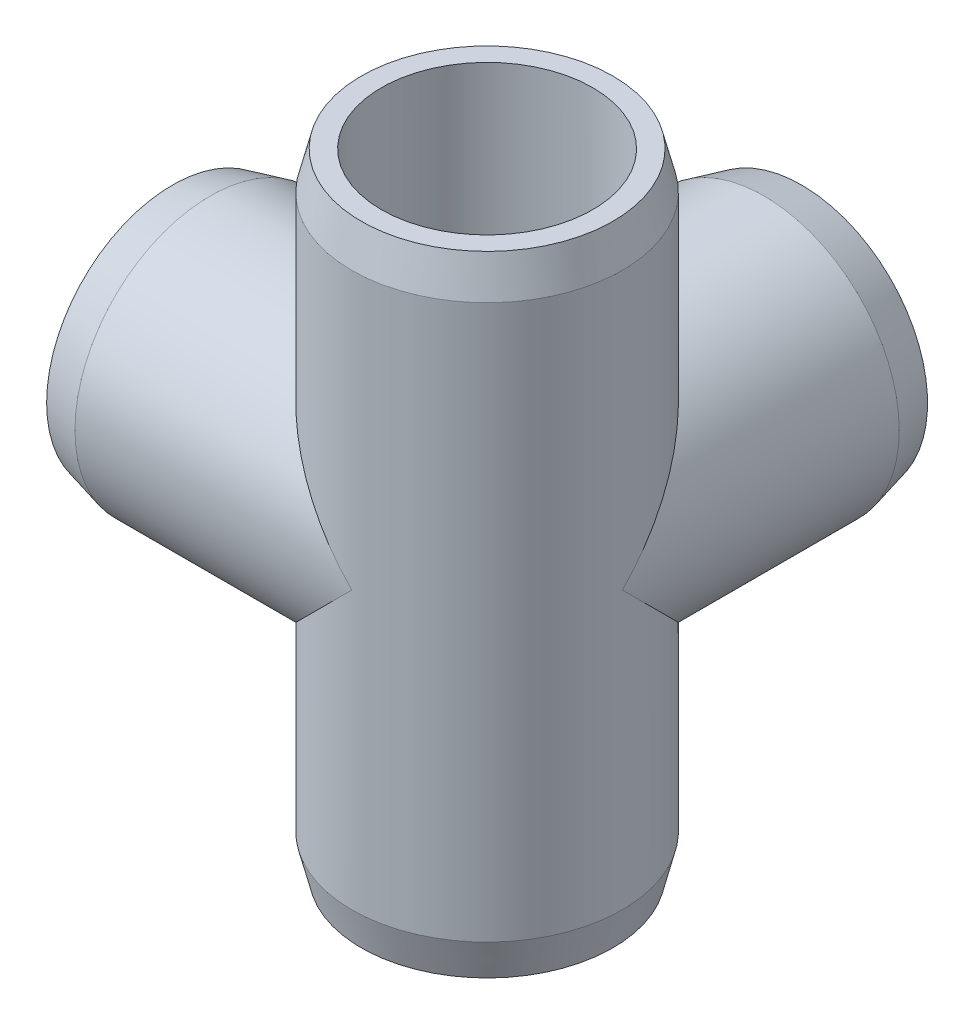
ISO-10303-21;
HEADER;
FILE_DESCRIPTION(('STEP AP214'),'2;1');
FILE_NAME('part.step','',(''),(''),'','','');
FILE_SCHEMA(('AUTOMOTIVE_DESIGN { 1 0 10303 214 1 1 1 1 }'));
ENDSEC;
DATA;
#1=APPLICATION_CONTEXT('core data for automotive mechanical design processes');
#2=APPLICATION_PROTOCOL_DEFINITION('international standard','automotive_design',2000,#1);
#3=PRODUCT_CONTEXT('',#1,'mechanical');
#4=PRODUCT('Part','Part','',(#3));
#5=PRODUCT_RELATED_PRODUCT_CATEGORY('part','',(#4));
#6=PRODUCT_DEFINITION_FORMATION('','',#4);
#7=PRODUCT_DEFINITION_CONTEXT('part definition',#1,'design');
#8=PRODUCT_DEFINITION('design','',#6,#7);
#9=PRODUCT_DEFINITION_SHAPE('','',#8);
#10=(LENGTH_UNIT() NAMED_UNIT(*) SI_UNIT(.MILLI.,.METRE.));
#11=(NAMED_UNIT(*) PLANE_ANGLE_UNIT() SI_UNIT($,.RADIAN.));
#12=(NAMED_UNIT(*) SI_UNIT($,.STERADIAN.) SOLID_ANGLE_UNIT());
#13=UNCERTAINTY_MEASURE_WITH_UNIT(LENGTH_MEASURE(1.E-05),#10,'distance_accuracy_value','');
#14=(GEOMETRIC_REPRESENTATION_CONTEXT(3) GLOBAL_UNCERTAINTY_ASSIGNED_CONTEXT((#13)) GLOBAL_UNIT_ASSIGNED_CONTEXT((#10,
#11,#12)) REPRESENTATION_CONTEXT('',''));
#15=CARTESIAN_POINT('',(0.,0.,0.));
#16=DIRECTION('',(0.,0.,1.));
#17=DIRECTION('',(1.,0.,0.));
#18=AXIS2_PLACEMENT_3D('',#15,#16,#17);
#19=CARTESIAN_POINT('',(-31.75,31.75,0.));
#20=DIRECTION('',(-1.,0.,0.));
#21=DIRECTION('',(0.,0.,1.));
#22=AXIS2_PLACEMENT_3D('',#19,#20,#21);
#23=CYLINDRICAL_SURFACE('',#22,10.4775);
#24=CARTESIAN_POINT('',(-12.7,31.75,0.));
#25=DIRECTION('',(-1.,0.,0.));
#26=DIRECTION('',(0.,0.,1.));
#27=AXIS2_PLACEMENT_3D('',#24,#25,#26);
#28=CIRCLE('',#27,10.4775);
#29=CARTESIAN_POINT('',(-12.7,31.75,10.4775));
#30=VERTEX_POINT('',#29);
#31=EDGE_CURVE('E54',#30,#30,#28,.T.);
#32=ORIENTED_EDGE('',*,*,#31,.F.);
#33=EDGE_LOOP('',(#32));
#34=FACE_BOUND('',#33,.T.);
#35=CARTESIAN_POINT('',(-10.795,31.75,0.));
#36=DIRECTION('',(-1.,0.,0.));
#37=DIRECTION('',(0.,0.,1.));
#38=AXIS2_PLACEMENT_3D('',#35,#36,#37);
#39=CIRCLE('',#38,10.4775);
#40=CARTESIAN_POINT('',(-10.795,31.75,10.4775));
#41=VERTEX_POINT('',#40);
#42=EDGE_CURVE('E11',#41,#41,#39,.T.);
#43=ORIENTED_EDGE('',*,*,#42,.T.);
#44=EDGE_LOOP('',(#43));
#45=FACE_BOUND('',#44,.T.);
#46=ADVANCED_FACE('F40',(#34,#45),#23,.T.);
#47=CARTESIAN_POINT('',(-10.795,42.2275,0.));
#48=DIRECTION('',(-1.,0.,0.));
#49=DIRECTION('',(0.,0.,1.));
#50=AXIS2_PLACEMENT_3D('',#47,#48,#49);
#51=PLANE('',#50);
#52=ORIENTED_EDGE('',*,*,#42,.F.);
#53=EDGE_LOOP('',(#52));
#54=FACE_BOUND('',#53,.T.);
#55=CARTESIAN_POINT('',(-10.795,31.75,0.));
#56=DIRECTION('',(-1.,0.,0.));
#57=DIRECTION('',(0.,0.,1.));
#58=AXIS2_PLACEMENT_3D('',#55,#56,#57);
#59=CIRCLE('',#58,9.2075);
#60=CARTESIAN_POINT('',(-10.795,31.75,9.2075));
#61=VERTEX_POINT('',#60);
#62=EDGE_CURVE('E46',#61,#61,#59,.T.);
#63=ORIENTED_EDGE('',*,*,#62,.T.);
#64=EDGE_LOOP('',(#63));
#65=FACE_BOUND('',#64,.T.);
#66=ADVANCED_FACE('F63',(#54,#65),#51,.F.);
#67=CARTESIAN_POINT('',(-31.75,31.75,0.));
#68=DIRECTION('',(-1.,0.,0.));
#69=DIRECTION('',(0.,0.,1.));
#70=AXIS2_PLACEMENT_3D('',#67,#68,#69);
#71=CYLINDRICAL_SURFACE('',#70,9.2075);
#72=ORIENTED_EDGE('',*,*,#62,.F.);
#73=EDGE_LOOP('',(#72));
#74=FACE_BOUND('',#73,.T.);
#75=CARTESIAN_POINT('',(-12.7,31.75,0.));
#76=DIRECTION('',(-1.,0.,0.));
#77=DIRECTION('',(0.,0.,1.));
#78=AXIS2_PLACEMENT_3D('',#75,#76,#77);
#79=CIRCLE('',#78,9.2075);
#80=CARTESIAN_POINT('',(-12.7,31.75,9.2075));
#81=VERTEX_POINT('',#80);
#82=EDGE_CURVE('E50',#81,#81,#79,.T.);
#83=ORIENTED_EDGE('',*,*,#82,.T.);
#84=EDGE_LOOP('',(#83));
#85=FACE_BOUND('',#84,.T.);
#86=ADVANCED_FACE('F67',(#74,#85),#71,.F.);
#87=CARTESIAN_POINT('',(-12.7,40.9575,0.));
#88=DIRECTION('',(1.,0.,0.));
#89=DIRECTION('',(0.,0.,-1.));
#90=AXIS2_PLACEMENT_3D('',#87,#88,#89);
#91=PLANE('',#90);
#92=ORIENTED_EDGE('',*,*,#82,.F.);
#93=EDGE_LOOP('',(#92));
#94=FACE_BOUND('',#93,.T.);
#95=ORIENTED_EDGE('',*,*,#31,.T.);
#96=EDGE_LOOP('',(#95));
#97=FACE_BOUND('',#96,.T.);
#98=ADVANCED_FACE('F60',(#94,#97),#91,.F.);
#99=CLOSED_SHELL('',(#46,#66,#86,#98));
#100=MANIFOLD_SOLID_BREP('B2',#99);
#101=CARTESIAN_POINT('',(0.,0.,0.));
#102=DIRECTION('',(0.,-1.,0.));
#103=DIRECTION('',(0.,0.,-1.));
#104=AXIS2_PLACEMENT_3D('',#101,#102,#103);
#105=CYLINDRICAL_SURFACE('',#104,10.4775);
#106=CARTESIAN_POINT('',(0.,19.05,0.));
#107=DIRECTION('',(0.,-1.,0.));
#108=DIRECTION('',(0.,0.,-1.));
#109=AXIS2_PLACEMENT_3D('',#106,#107,#108);
#110=CIRCLE('',#109,10.4775);
#111=CARTESIAN_POINT('',(0.,19.05,-10.4775));
#112=VERTEX_POINT('',#111);
#113=EDGE_CURVE('E39',#112,#112,#110,.T.);
#114=ORIENTED_EDGE('',*,*,#113,.F.);
#115=EDGE_LOOP('',(#114));
#116=FACE_BOUND('',#115,.T.);
#117=CARTESIAN_POINT('',(0.,20.955,0.));
#118=DIRECTION('',(0.,-1.,0.));
#119=DIRECTION('',(0.,0.,-1.));
#120=AXIS2_PLACEMENT_3D('',#117,#118,#119);
#121=CIRCLE('',#120,10.4775);
#122=CARTESIAN_POINT('',(0.,20.955,-10.4775));
#123=VERTEX_POINT('',#122);
#124=EDGE_CURVE('E124',#123,#123,#121,.T.);
#125=ORIENTED_EDGE('',*,*,#124,.T.);
#126=EDGE_LOOP('',(#125));
#127=FACE_BOUND('',#126,.T.);
#128=ADVANCED_FACE('F110',(#116,#127),#105,.T.);
#129=CARTESIAN_POINT('',(-10.4775,19.05,0.));
#130=DIRECTION('',(0.,1.,0.));
#131=DIRECTION('',(0.,0.,1.));
#132=AXIS2_PLACEMENT_3D('',#129,#130,#131);
#133=PLANE('',#132);
#134=CARTESIAN_POINT('',(0.,19.05,0.));
#135=DIRECTION('',(0.,-1.,0.));
#136=DIRECTION('',(0.,0.,-1.));
#137=AXIS2_PLACEMENT_3D('',#134,#135,#136);
#138=CIRCLE('',#137,9.2075);
#139=CARTESIAN_POINT('',(0.,19.05,-9.2075));
#140=VERTEX_POINT('',#139);
#141=EDGE_CURVE('E116',#140,#140,#138,.T.);
#142=ORIENTED_EDGE('',*,*,#141,.F.);
#143=EDGE_LOOP('',(#142));
#144=FACE_BOUND('',#143,.T.);
#145=ORIENTED_EDGE('',*,*,#113,.T.);
#146=EDGE_LOOP('',(#145));
#147=FACE_BOUND('',#146,.T.);
#148=ADVANCED_FACE('F139',(#144,#147),#133,.F.);
#149=CARTESIAN_POINT('',(0.,0.,0.));
#150=DIRECTION('',(0.,-1.,0.));
#151=DIRECTION('',(0.,0.,-1.));
#152=AXIS2_PLACEMENT_3D('',#149,#150,#151);
#153=CYLINDRICAL_SURFACE('',#152,9.2075);
#154=CARTESIAN_POINT('',(0.,20.955,0.));
#155=DIRECTION('',(0.,-1.,0.));
#156=DIRECTION('',(0.,0.,-1.));
#157=AXIS2_PLACEMENT_3D('',#154,#155,#156);
#158=CIRCLE('',#157,9.2075);
#159=CARTESIAN_POINT('',(0.,20.955,-9.2075));
#160=VERTEX_POINT('',#159);
#161=EDGE_CURVE('E120',#160,#160,#158,.T.);
#162=ORIENTED_EDGE('',*,*,#161,.F.);
#163=EDGE_LOOP('',(#162));
#164=FACE_BOUND('',#163,.T.);
#165=ORIENTED_EDGE('',*,*,#141,.T.);
#166=EDGE_LOOP('',(#165));
#167=FACE_BOUND('',#166,.T.);
#168=ADVANCED_FACE('F134',(#164,#167),#153,.F.);
#169=CARTESIAN_POINT('',(-9.2075,20.955,0.));
#170=DIRECTION('',(0.,-1.,0.));
#171=DIRECTION('',(0.,0.,-1.));
#172=AXIS2_PLACEMENT_3D('',#169,#170,#171);
#173=PLANE('',#172);
#174=ORIENTED_EDGE('',*,*,#124,.F.);
#175=EDGE_LOOP('',(#174));
#176=FACE_BOUND('',#175,.T.);
#177=ORIENTED_EDGE('',*,*,#161,.T.);
#178=EDGE_LOOP('',(#177));
#179=FACE_BOUND('',#178,.T.);
#180=ADVANCED_FACE('F131',(#176,#179),#173,.F.);
#181=CLOSED_SHELL('',(#128,#148,#168,#180));
#182=MANIFOLD_SOLID_BREP('B6',#181);
#183=CARTESIAN_POINT('',(0.,63.5,0.));
#184=DIRECTION('',(0.,1.,0.));
#185=DIRECTION('',(0.,0.,1.));
#186=AXIS2_PLACEMENT_3D('',#183,#184,#185);
#187=CYLINDRICAL_SURFACE('',#186,10.4775);
#188=CARTESIAN_POINT('',(0.,42.545,0.));
#189=DIRECTION('',(0.,1.,0.));
#190=DIRECTION('',(0.,0.,1.));
#191=AXIS2_PLACEMENT_3D('',#188,#189,#190);
#192=CIRCLE('',#191,10.4775);
#193=CARTESIAN_POINT('',(0.,42.545,10.4775));
#194=VERTEX_POINT('',#193);
#195=EDGE_CURVE('E195',#194,#194,#192,.T.);
#196=ORIENTED_EDGE('',*,*,#195,.T.);
#197=EDGE_LOOP('',(#196));
#198=FACE_BOUND('',#197,.T.);
#199=CARTESIAN_POINT('',(0.,44.45,0.));
#200=DIRECTION('',(0.,1.,0.));
#201=DIRECTION('',(0.,0.,1.));
#202=AXIS2_PLACEMENT_3D('',#199,#200,#201);
#203=CIRCLE('',#202,10.4775);
#204=CARTESIAN_POINT('',(0.,44.45,10.4775));
#205=VERTEX_POINT('',#204);
#206=EDGE_CURVE('E109',#205,#205,#203,.T.);
#207=ORIENTED_EDGE('',*,*,#206,.F.);
#208=EDGE_LOOP('',(#207));
#209=FACE_BOUND('',#208,.T.);
#210=ADVANCED_FACE('F181',(#198,#209),#187,.T.);
#211=CARTESIAN_POINT('',(-10.4775,44.45,0.));
#212=DIRECTION('',(0.,1.,0.));
#213=DIRECTION('',(0.,0.,1.));
#214=AXIS2_PLACEMENT_3D('',#211,#212,#213);
#215=PLANE('',#214);
#216=ORIENTED_EDGE('',*,*,#206,.T.);
#217=EDGE_LOOP('',(#216));
#218=FACE_BOUND('',#217,.T.);
#219=CARTESIAN_POINT('',(0.,44.45,0.));
#220=DIRECTION('',(0.,1.,0.));
#221=DIRECTION('',(0.,0.,1.));
#222=AXIS2_PLACEMENT_3D('',#219,#220,#221);
#223=CIRCLE('',#222,9.2075);
#224=CARTESIAN_POINT('',(0.,44.45,9.2075));
#225=VERTEX_POINT('',#224);
#226=EDGE_CURVE('E187',#225,#225,#223,.T.);
#227=ORIENTED_EDGE('',*,*,#226,.F.);
#228=EDGE_LOOP('',(#227));
#229=FACE_BOUND('',#228,.T.);
#230=ADVANCED_FACE('F211',(#218,#229),#215,.T.);
#231=CARTESIAN_POINT('',(0.,63.5,0.));
#232=DIRECTION('',(0.,1.,0.));
#233=DIRECTION('',(0.,0.,1.));
#234=AXIS2_PLACEMENT_3D('',#231,#232,#233);
#235=CYLINDRICAL_SURFACE('',#234,9.2075);
#236=ORIENTED_EDGE('',*,*,#226,.T.);
#237=EDGE_LOOP('',(#236));
#238=FACE_BOUND('',#237,.T.);
#239=CARTESIAN_POINT('',(0.,42.545,0.));
#240=DIRECTION('',(0.,1.,0.));
#241=DIRECTION('',(0.,0.,1.));
#242=AXIS2_PLACEMENT_3D('',#239,#240,#241);
#243=CIRCLE('',#242,9.2075);
#244=CARTESIAN_POINT('',(0.,42.545,9.2075));
#245=VERTEX_POINT('',#244);
#246=EDGE_CURVE('E191',#245,#245,#243,.T.);
#247=ORIENTED_EDGE('',*,*,#246,.F.);
#248=EDGE_LOOP('',(#247));
#249=FACE_BOUND('',#248,.T.);
#250=ADVANCED_FACE('F205',(#238,#249),#235,.F.);
#251=CARTESIAN_POINT('',(-9.2075,42.545,0.));
#252=DIRECTION('',(0.,-1.,0.));
#253=DIRECTION('',(0.,0.,-1.));
#254=AXIS2_PLACEMENT_3D('',#251,#252,#253);
#255=PLANE('',#254);
#256=ORIENTED_EDGE('',*,*,#246,.T.);
#257=EDGE_LOOP('',(#256));
#258=FACE_BOUND('',#257,.T.);
#259=ORIENTED_EDGE('',*,*,#195,.F.);
#260=EDGE_LOOP('',(#259));
#261=FACE_BOUND('',#260,.T.);
#262=ADVANCED_FACE('F203',(#258,#261),#255,.T.);
#263=CLOSED_SHELL('',(#210,#230,#250,#262));
#264=MANIFOLD_SOLID_BREP('B34',#263);
#265=CARTESIAN_POINT('',(0.,63.5,0.));
#266=DIRECTION('',(0.,-1.,0.));
#267=DIRECTION('',(0.,0.,-1.));
#268=AXIS2_PLACEMENT_3D('',#265,#266,#267);
#269=CYLINDRICAL_SURFACE('',#268,13.6525);
#270=CARTESIAN_POINT('',(0.,3.81,0.));
#271=DIRECTION('',(0.,-1.,0.));
#272=DIRECTION('',(0.,0.,-1.));
#273=AXIS2_PLACEMENT_3D('',#270,#271,#272);
#274=CIRCLE('',#273,13.6525);
#275=CARTESIAN_POINT('',(0.,3.81,-13.6525));
#276=VERTEX_POINT('',#275);
#277=EDGE_CURVE('E346',#276,#276,#274,.T.);
#278=ORIENTED_EDGE('',*,*,#277,.F.);
#279=EDGE_LOOP('',(#278));
#280=FACE_BOUND('',#279,.T.);
#281=CARTESIAN_POINT('',(0.,31.75,0.));
#282=DIRECTION('',(-0.707106781186547,-0.707106781186547,0.));
#283=DIRECTION('',(-0.707106781186547,0.707106781186547,0.));
#284=AXIS2_PLACEMENT_3D('',#281,#282,#283);
#285=ELLIPSE('',#284,19.3075506602987,13.6525);
#286=CARTESIAN_POINT('',(-9.65377533014934,41.4037753301493,-9.65377533014934));
#287=VERTEX_POINT('',#286);
#288=CARTESIAN_POINT('',(0.,31.75,13.6525));
#289=VERTEX_POINT('',#288);
#290=EDGE_CURVE('E257',#287,#289,#285,.F.);
#291=ORIENTED_EDGE('',*,*,#290,.T.);
#292=CARTESIAN_POINT('',(0.,31.75,0.));
#293=DIRECTION('',(-0.707106781186547,0.707106781186547,0.));
#294=DIRECTION('',(-0.707106781186547,-0.707106781186547,0.));
#295=AXIS2_PLACEMENT_3D('',#292,#293,#294);
#296=ELLIPSE('',#295,19.3075506602987,13.6525);
#297=CARTESIAN_POINT('',(-9.65377533014934,22.0962246698507,-9.65377533014934));
#298=VERTEX_POINT('',#297);
#299=EDGE_CURVE('E285',#289,#298,#296,.F.);
#300=ORIENTED_EDGE('',*,*,#299,.T.);
#301=CARTESIAN_POINT('',(0.,31.75,0.));
#302=DIRECTION('',(0.,0.707106781186547,-0.707106781186547));
#303=DIRECTION('',(0.,-0.707106781186547,-0.707106781186547));
#304=AXIS2_PLACEMENT_3D('',#301,#302,#303);
#305=ELLIPSE('',#304,19.3075506602987,13.6525);
#306=CARTESIAN_POINT('',(13.6525,31.75,0.));
#307=VERTEX_POINT('',#306);
#308=EDGE_CURVE('E280',#298,#307,#305,.F.);
#309=ORIENTED_EDGE('',*,*,#308,.T.);
#310=CARTESIAN_POINT('',(0.,31.75,0.));
#311=DIRECTION('',(0.,-0.707106781186547,-0.707106781186547));
#312=DIRECTION('',(0.,0.707106781186547,-0.707106781186547));
#313=AXIS2_PLACEMENT_3D('',#310,#311,#312);
#314=ELLIPSE('',#313,19.3075506602987,13.6525);
#315=EDGE_CURVE('E282',#307,#287,#314,.F.);
#316=ORIENTED_EDGE('',*,*,#315,.T.);
#317=EDGE_LOOP('',(#291,#300,#309,#316));
#318=FACE_BOUND('',#317,.T.);
#319=CARTESIAN_POINT('',(0.,59.69,0.));
#320=DIRECTION('',(0.,-1.,0.));
#321=DIRECTION('',(0.,0.,-1.));
#322=AXIS2_PLACEMENT_3D('',#319,#320,#321);
#323=CIRCLE('',#322,13.6525);
#324=CARTESIAN_POINT('',(0.,59.69,-13.6525));
#325=VERTEX_POINT('',#324);
#326=EDGE_CURVE('E352',#325,#325,#323,.T.);
#327=ORIENTED_EDGE('',*,*,#326,.T.);
#328=EDGE_LOOP('',(#327));
#329=FACE_BOUND('',#328,.T.);
#330=ADVANCED_FACE('F243',(#280,#318,#329),#269,.T.);
#331=CARTESIAN_POINT('',(0.,63.5,0.));
#332=DIRECTION('',(0.,1.,0.));
#333=DIRECTION('',(0.,0.,1.));
#334=AXIS2_PLACEMENT_3D('',#331,#332,#333);
#335=PLANE('',#334);
#336=CARTESIAN_POINT('',(0.,63.5,0.));
#337=DIRECTION('',(0.,1.,0.));
#338=DIRECTION('',(0.,0.,1.));
#339=AXIS2_PLACEMENT_3D('',#336,#337,#338);
#340=CIRCLE('',#339,10.668);
#341=CARTESIAN_POINT('',(0.,63.5,10.668));
#342=VERTEX_POINT('',#341);
#343=EDGE_CURVE('E306',#342,#342,#340,.T.);
#344=ORIENTED_EDGE('',*,*,#343,.F.);
#345=EDGE_LOOP('',(#344));
#346=FACE_BOUND('',#345,.T.);
#347=CARTESIAN_POINT('',(0.,63.5,0.));
#348=DIRECTION('',(0.,-1.,0.));
#349=DIRECTION('',(0.,0.,-1.));
#350=AXIS2_PLACEMENT_3D('',#347,#348,#349);
#351=CIRCLE('',#350,12.7);
#352=CARTESIAN_POINT('',(0.,63.5,-12.7));
#353=VERTEX_POINT('',#352);
#354=EDGE_CURVE('E355',#353,#353,#351,.T.);
#355=ORIENTED_EDGE('',*,*,#354,.F.);
#356=EDGE_LOOP('',(#355));
#357=FACE_BOUND('',#356,.T.);
#358=ADVANCED_FACE('F385',(#346,#357),#335,.T.);
#359=CARTESIAN_POINT('',(0.,0.,0.));
#360=DIRECTION('',(0.,1.,0.));
#361=DIRECTION('',(0.,0.,1.));
#362=AXIS2_PLACEMENT_3D('',#359,#360,#361);
#363=PLANE('',#362);
#364=CARTESIAN_POINT('',(0.,0.,0.));
#365=DIRECTION('',(0.,1.,0.));
#366=DIRECTION('',(0.,0.,1.));
#367=AXIS2_PLACEMENT_3D('',#364,#365,#366);
#368=CIRCLE('',#367,10.668);
#369=CARTESIAN_POINT('',(0.,0.,10.668));
#370=VERTEX_POINT('',#369);
#371=EDGE_CURVE('E283',#370,#370,#368,.T.);
#372=ORIENTED_EDGE('',*,*,#371,.T.);
#373=EDGE_LOOP('',(#372));
#374=FACE_BOUND('',#373,.T.);
#375=CARTESIAN_POINT('',(0.,0.,0.));
#376=DIRECTION('',(0.,-1.,0.));
#377=DIRECTION('',(0.,0.,-1.));
#378=AXIS2_PLACEMENT_3D('',#375,#376,#377);
#379=CIRCLE('',#378,12.7);
#380=CARTESIAN_POINT('',(0.,0.,-12.7));
#381=VERTEX_POINT('',#380);
#382=EDGE_CURVE('E349',#381,#381,#379,.T.);
#383=ORIENTED_EDGE('',*,*,#382,.T.);
#384=EDGE_LOOP('',(#383));
#385=FACE_BOUND('',#384,.T.);
#386=ADVANCED_FACE('F390',(#374,#385),#363,.F.);
#387=CARTESIAN_POINT('',(0.,31.75,-69.85));
#388=DIRECTION('',(0.,0.,1.));
#389=DIRECTION('',(1.,0.,0.));
#390=AXIS2_PLACEMENT_3D('',#387,#388,#389);
#391=CYLINDRICAL_SURFACE('',#390,10.668);
#392=CARTESIAN_POINT('',(0.,31.75,-12.7));
#393=DIRECTION('',(0.,0.,-1.));
#394=DIRECTION('',(0.,1.,0.));
#395=AXIS2_PLACEMENT_3D('',#392,#393,#394);
#396=CIRCLE('',#395,10.668);
#397=CARTESIAN_POINT('',(0.,42.418,-12.7));
#398=VERTEX_POINT('',#397);
#399=EDGE_CURVE('E332',#398,#398,#396,.T.);
#400=ORIENTED_EDGE('',*,*,#399,.F.);
#401=EDGE_LOOP('',(#400));
#402=FACE_BOUND('',#401,.T.);
#403=CARTESIAN_POINT('',(0.,31.75,-31.75));
#404=DIRECTION('',(0.,0.,1.));
#405=DIRECTION('',(1.,0.,0.));
#406=AXIS2_PLACEMENT_3D('',#403,#404,#405);
#407=CIRCLE('',#406,10.668);
#408=CARTESIAN_POINT('',(10.668,31.75,-31.75));
#409=VERTEX_POINT('',#408);
#410=EDGE_CURVE('E302',#409,#409,#407,.T.);
#411=ORIENTED_EDGE('',*,*,#410,.F.);
#412=EDGE_LOOP('',(#411));
#413=FACE_BOUND('',#412,.T.);
#414=ADVANCED_FACE('F404',(#402,#413),#391,.F.);
#415=CARTESIAN_POINT('',(0.,31.75,13.6535));
#416=DIRECTION('',(0.,0.,-1.));
#417=DIRECTION('',(-1.,0.,0.));
#418=AXIS2_PLACEMENT_3D('',#415,#416,#417);
#419=CYLINDRICAL_SURFACE('',#418,13.6525);
#420=CARTESIAN_POINT('',(0.,31.75,-27.94));
#421=DIRECTION('',(0.,0.,-1.));
#422=DIRECTION('',(-1.,0.,0.));
#423=AXIS2_PLACEMENT_3D('',#420,#421,#422);
#424=CIRCLE('',#423,13.6525);
#425=CARTESIAN_POINT('',(-13.6525,31.75,-27.94));
#426=VERTEX_POINT('',#425);
#427=EDGE_CURVE('E361',#426,#426,#424,.T.);
#428=ORIENTED_EDGE('',*,*,#427,.F.);
#429=EDGE_LOOP('',(#428));
#430=FACE_BOUND('',#429,.T.);
#431=CARTESIAN_POINT('',(0.,31.75,0.));
#432=DIRECTION('',(0.707106781186547,0.,-0.707106781186547));
#433=DIRECTION('',(-0.707106781186547,0.,-0.707106781186547));
#434=AXIS2_PLACEMENT_3D('',#431,#432,#433);
#435=ELLIPSE('',#434,19.3075506602987,13.6525);
#436=EDGE_CURVE('E179',#287,#298,#435,.F.);
#437=ORIENTED_EDGE('',*,*,#436,.F.);
#438=ORIENTED_EDGE('',*,*,#315,.F.);
#439=ORIENTED_EDGE('',*,*,#308,.F.);
#440=EDGE_LOOP('',(#437,#438,#439));
#441=FACE_BOUND('',#440,.T.);
#442=ADVANCED_FACE('F281',(#430,#441),#419,.T.);
#443=CARTESIAN_POINT('',(0.,63.5,0.));
#444=DIRECTION('',(0.,-1.,0.));
#445=DIRECTION('',(0.,0.,-1.));
#446=AXIS2_PLACEMENT_3D('',#443,#444,#445);
#447=CYLINDRICAL_SURFACE('',#446,10.668);
#448=CARTESIAN_POINT('',(0.,31.75,0.));
#449=DIRECTION('',(0.707106781186547,-0.707106781186547,0.));
#450=DIRECTION('',(-0.707106781186547,-0.707106781186547,0.));
#451=AXIS2_PLACEMENT_3D('',#448,#449,#450);
#452=ELLIPSE('',#451,15.0868302833962,10.668);
#453=CARTESIAN_POINT('',(0.,31.75,10.668));
#454=VERTEX_POINT('',#453);
#455=CARTESIAN_POINT('',(-7.54341514169809,24.2065848583019,-7.54341514169809));
#456=VERTEX_POINT('',#455);
#457=EDGE_CURVE('E299',#454,#456,#452,.T.);
#458=ORIENTED_EDGE('',*,*,#457,.F.);
#459=CARTESIAN_POINT('',(0.,31.75,0.));
#460=DIRECTION('',(-0.707106781186547,-0.707106781186547,0.));
#461=DIRECTION('',(0.707106781186547,-0.707106781186547,0.));
#462=AXIS2_PLACEMENT_3D('',#459,#460,#461);
#463=ELLIPSE('',#462,15.0868302833962,10.668);
#464=CARTESIAN_POINT('',(-7.54341514169809,39.2934151416981,-7.54341514169809));
#465=VERTEX_POINT('',#464);
#466=EDGE_CURVE('E293',#465,#454,#463,.F.);
#467=ORIENTED_EDGE('',*,*,#466,.F.);
#468=CARTESIAN_POINT('',(0.,31.75,0.));
#469=DIRECTION('',(0.,-0.707106781186547,-0.707106781186547));
#470=DIRECTION('',(0.,-0.707106781186547,0.707106781186547));
#471=AXIS2_PLACEMENT_3D('',#468,#469,#470);
#472=ELLIPSE('',#471,15.0868302833962,10.668);
#473=CARTESIAN_POINT('',(10.668,31.75,0.));
#474=VERTEX_POINT('',#473);
#475=EDGE_CURVE('E309',#474,#465,#472,.F.);
#476=ORIENTED_EDGE('',*,*,#475,.F.);
#477=CARTESIAN_POINT('',(0.,31.75,0.));
#478=DIRECTION('',(0.,-0.707106781186547,0.707106781186547));
#479=DIRECTION('',(0.,-0.707106781186547,-0.707106781186547));
#480=AXIS2_PLACEMENT_3D('',#477,#478,#479);
#481=ELLIPSE('',#480,15.0868302833962,10.668);
#482=EDGE_CURVE('E250',#456,#474,#481,.T.);
#483=ORIENTED_EDGE('',*,*,#482,.F.);
#484=EDGE_LOOP('',(#458,#467,#476,#483));
#485=FACE_BOUND('',#484,.T.);
#486=ORIENTED_EDGE('',*,*,#343,.T.);
#487=EDGE_LOOP('',(#486));
#488=FACE_BOUND('',#487,.T.);
#489=ORIENTED_EDGE('',*,*,#371,.F.);
#490=EDGE_LOOP('',(#489));
#491=FACE_BOUND('',#490,.T.);
#492=ADVANCED_FACE('F320',(#485,#488,#491),#447,.F.);
#493=CARTESIAN_POINT('',(0.,31.75,-10.795));
#494=DIRECTION('',(0.,0.,-1.));
#495=DIRECTION('',(0.,1.,0.));
#496=AXIS2_PLACEMENT_3D('',#493,#494,#495);
#497=CIRCLE('',#496,10.668);
#498=CARTESIAN_POINT('',(0.,42.418,-10.795));
#499=VERTEX_POINT('',#498);
#500=EDGE_CURVE('E343',#499,#499,#497,.T.);
#501=ORIENTED_EDGE('',*,*,#500,.T.);
#502=EDGE_LOOP('',(#501));
#503=FACE_BOUND('',#502,.T.);
#504=CARTESIAN_POINT('',(0.,31.75,0.));
#505=DIRECTION('',(-0.707106781186547,0.,0.707106781186547));
#506=DIRECTION('',(0.707106781186547,0.,0.707106781186547));
#507=AXIS2_PLACEMENT_3D('',#504,#505,#506);
#508=ELLIPSE('',#507,15.0868302833962,10.668);
#509=EDGE_CURVE('E291',#465,#456,#508,.T.);
#510=ORIENTED_EDGE('',*,*,#509,.T.);
#511=ORIENTED_EDGE('',*,*,#482,.T.);
#512=ORIENTED_EDGE('',*,*,#475,.T.);
#513=EDGE_LOOP('',(#510,#511,#512));
#514=FACE_BOUND('',#513,.T.);
#515=ADVANCED_FACE('F316',(#503,#514),#391,.F.);
#516=CARTESIAN_POINT('',(0.,31.75,-31.75));
#517=DIRECTION('',(0.,0.,1.));
#518=DIRECTION('',(1.,0.,0.));
#519=AXIS2_PLACEMENT_3D('',#516,#517,#518);
#520=PLANE('',#519);
#521=CARTESIAN_POINT('',(0.,31.75,-31.75));
#522=DIRECTION('',(0.,0.,-1.));
#523=DIRECTION('',(-1.,0.,0.));
#524=AXIS2_PLACEMENT_3D('',#521,#522,#523);
#525=CIRCLE('',#524,12.7);
#526=CARTESIAN_POINT('',(-12.7,31.75,-31.75));
#527=VERTEX_POINT('',#526);
#528=EDGE_CURVE('E358',#527,#527,#525,.T.);
#529=ORIENTED_EDGE('',*,*,#528,.T.);
#530=EDGE_LOOP('',(#529));
#531=FACE_BOUND('',#530,.T.);
#532=ORIENTED_EDGE('',*,*,#410,.T.);
#533=EDGE_LOOP('',(#532));
#534=FACE_BOUND('',#533,.T.);
#535=ADVANCED_FACE('F327',(#531,#534),#520,.F.);
#536=CARTESIAN_POINT('',(-69.85,31.75,0.));
#537=DIRECTION('',(1.,0.,0.));
#538=DIRECTION('',(0.,0.,-1.));
#539=AXIS2_PLACEMENT_3D('',#536,#537,#538);
#540=CYLINDRICAL_SURFACE('',#539,10.668);
#541=ORIENTED_EDGE('',*,*,#457,.T.);
#542=ORIENTED_EDGE('',*,*,#509,.F.);
#543=ORIENTED_EDGE('',*,*,#466,.T.);
#544=EDGE_LOOP('',(#541,#542,#543));
#545=FACE_BOUND('',#544,.T.);
#546=CARTESIAN_POINT('',(-31.75,31.75,0.));
#547=DIRECTION('',(1.,0.,0.));
#548=DIRECTION('',(0.,0.,-1.));
#549=AXIS2_PLACEMENT_3D('',#546,#547,#548);
#550=CIRCLE('',#549,10.668);
#551=CARTESIAN_POINT('',(-31.75,31.75,-10.668));
#552=VERTEX_POINT('',#551);
#553=EDGE_CURVE('E288',#552,#552,#550,.T.);
#554=ORIENTED_EDGE('',*,*,#553,.F.);
#555=EDGE_LOOP('',(#554));
#556=FACE_BOUND('',#555,.T.);
#557=ADVANCED_FACE('F323',(#545,#556),#540,.F.);
#558=CARTESIAN_POINT('',(-31.75,31.75,0.));
#559=DIRECTION('',(1.,0.,0.));
#560=DIRECTION('',(0.,0.,-1.));
#561=AXIS2_PLACEMENT_3D('',#558,#559,#560);
#562=PLANE('',#561);
#563=CARTESIAN_POINT('',(-31.75,31.75,0.));
#564=DIRECTION('',(-1.,0.,0.));
#565=DIRECTION('',(0.,0.,1.));
#566=AXIS2_PLACEMENT_3D('',#563,#564,#565);
#567=CIRCLE('',#566,12.7);
#568=CARTESIAN_POINT('',(-31.75,31.75,12.7));
#569=VERTEX_POINT('',#568);
#570=EDGE_CURVE('E364',#569,#569,#567,.T.);
#571=ORIENTED_EDGE('',*,*,#570,.T.);
#572=EDGE_LOOP('',(#571));
#573=FACE_BOUND('',#572,.T.);
#574=ORIENTED_EDGE('',*,*,#553,.T.);
#575=EDGE_LOOP('',(#574));
#576=FACE_BOUND('',#575,.T.);
#577=ADVANCED_FACE('F326',(#573,#576),#562,.F.);
#578=CARTESIAN_POINT('',(13.6535,31.75,0.));
#579=DIRECTION('',(-1.,0.,0.));
#580=DIRECTION('',(0.,0.,1.));
#581=AXIS2_PLACEMENT_3D('',#578,#579,#580);
#582=CYLINDRICAL_SURFACE('',#581,13.6525);
#583=CARTESIAN_POINT('',(-27.94,31.75,0.));
#584=DIRECTION('',(-1.,0.,0.));
#585=DIRECTION('',(0.,0.,1.));
#586=AXIS2_PLACEMENT_3D('',#583,#584,#585);
#587=CIRCLE('',#586,13.6525);
#588=CARTESIAN_POINT('',(-27.94,31.75,13.6525));
#589=VERTEX_POINT('',#588);
#590=EDGE_CURVE('E367',#589,#589,#587,.T.);
#591=ORIENTED_EDGE('',*,*,#590,.F.);
#592=EDGE_LOOP('',(#591));
#593=FACE_BOUND('',#592,.T.);
#594=ORIENTED_EDGE('',*,*,#290,.F.);
#595=ORIENTED_EDGE('',*,*,#436,.T.);
#596=ORIENTED_EDGE('',*,*,#299,.F.);
#597=EDGE_LOOP('',(#594,#595,#596));
#598=FACE_BOUND('',#597,.T.);
#599=ADVANCED_FACE('F290',(#593,#598),#582,.T.);
#600=CARTESIAN_POINT('',(0.,42.418,-12.7));
#601=DIRECTION('',(0.,0.,-1.));
#602=DIRECTION('',(0.,1.,0.));
#603=AXIS2_PLACEMENT_3D('',#600,#601,#602);
#604=PLANE('',#603);
#605=ORIENTED_EDGE('',*,*,#399,.T.);
#606=EDGE_LOOP('',(#605));
#607=FACE_BOUND('',#606,.T.);
#608=CARTESIAN_POINT('',(0.,31.75,-12.7));
#609=DIRECTION('',(0.,0.,-1.));
#610=DIRECTION('',(0.,1.,0.));
#611=AXIS2_PLACEMENT_3D('',#608,#609,#610);
#612=CIRCLE('',#611,9.398);
#613=CARTESIAN_POINT('',(0.,41.148,-12.7));
#614=VERTEX_POINT('',#613);
#615=EDGE_CURVE('E334',#614,#614,#612,.T.);
#616=ORIENTED_EDGE('',*,*,#615,.F.);
#617=EDGE_LOOP('',(#616));
#618=FACE_BOUND('',#617,.T.);
#619=ADVANCED_FACE('F374',(#607,#618),#604,.T.);
#620=CARTESIAN_POINT('',(0.,31.75,-31.75));
#621=DIRECTION('',(0.,0.,-1.));
#622=DIRECTION('',(0.,1.,0.));
#623=AXIS2_PLACEMENT_3D('',#620,#621,#622);
#624=CYLINDRICAL_SURFACE('',#623,9.398);
#625=ORIENTED_EDGE('',*,*,#615,.T.);
#626=EDGE_LOOP('',(#625));
#627=FACE_BOUND('',#626,.T.);
#628=CARTESIAN_POINT('',(0.,31.75,-10.795));
#629=DIRECTION('',(0.,0.,-1.));
#630=DIRECTION('',(0.,1.,0.));
#631=AXIS2_PLACEMENT_3D('',#628,#629,#630);
#632=CIRCLE('',#631,9.398);
#633=CARTESIAN_POINT('',(0.,41.148,-10.795));
#634=VERTEX_POINT('',#633);
#635=EDGE_CURVE('E338',#634,#634,#632,.T.);
#636=ORIENTED_EDGE('',*,*,#635,.F.);
#637=EDGE_LOOP('',(#636));
#638=FACE_BOUND('',#637,.T.);
#639=ADVANCED_FACE('F380',(#627,#638),#624,.F.);
#640=CARTESIAN_POINT('',(0.,41.148,-10.795));
#641=DIRECTION('',(0.,0.,1.));
#642=DIRECTION('',(0.,-1.,0.));
#643=AXIS2_PLACEMENT_3D('',#640,#641,#642);
#644=PLANE('',#643);
#645=ORIENTED_EDGE('',*,*,#635,.T.);
#646=EDGE_LOOP('',(#645));
#647=FACE_BOUND('',#646,.T.);
#648=ORIENTED_EDGE('',*,*,#500,.F.);
#649=EDGE_LOOP('',(#648));
#650=FACE_BOUND('',#649,.T.);
#651=ADVANCED_FACE('F399',(#647,#650),#644,.T.);
#652=CARTESIAN_POINT('',(0.,0.,0.));
#653=DIRECTION('',(0.,1.,0.));
#654=DIRECTION('',(0.,0.,1.));
#655=AXIS2_PLACEMENT_3D('',#652,#653,#654);
#656=CONICAL_SURFACE('',#655,12.7,0.244978663126864);
#657=ORIENTED_EDGE('',*,*,#277,.T.);
#658=EDGE_LOOP('',(#657));
#659=FACE_BOUND('',#658,.T.);
#660=ORIENTED_EDGE('',*,*,#382,.F.);
#661=EDGE_LOOP('',(#660));
#662=FACE_BOUND('',#661,.T.);
#663=ADVANCED_FACE('F395',(#659,#662),#656,.T.);
#664=CARTESIAN_POINT('',(0.,63.5,0.));
#665=DIRECTION('',(0.,-1.,0.));
#666=DIRECTION('',(0.,0.,1.));
#667=AXIS2_PLACEMENT_3D('',#664,#665,#666);
#668=CONICAL_SURFACE('',#667,12.7,0.244978663126864);
#669=ORIENTED_EDGE('',*,*,#326,.F.);
#670=EDGE_LOOP('',(#669));
#671=FACE_BOUND('',#670,.T.);
#672=ORIENTED_EDGE('',*,*,#354,.T.);
#673=EDGE_LOOP('',(#672));
#674=FACE_BOUND('',#673,.T.);
#675=ADVANCED_FACE('F398',(#671,#674),#668,.T.);
#676=CARTESIAN_POINT('',(0.,31.75,-27.94));
#677=DIRECTION('',(0.,0.,1.));
#678=DIRECTION('',(1.,0.,0.));
#679=AXIS2_PLACEMENT_3D('',#676,#677,#678);
#680=CONICAL_SURFACE('',#679,13.6525,0.244978663126864);
#681=ORIENTED_EDGE('',*,*,#528,.F.);
#682=EDGE_LOOP('',(#681));
#683=FACE_BOUND('',#682,.T.);
#684=ORIENTED_EDGE('',*,*,#427,.T.);
#685=EDGE_LOOP('',(#684));
#686=FACE_BOUND('',#685,.T.);
#687=ADVANCED_FACE('F428',(#683,#686),#680,.T.);
#688=CARTESIAN_POINT('',(-27.94,31.75,0.));
#689=DIRECTION('',(1.,0.,0.));
#690=DIRECTION('',(0.,0.,-1.));
#691=AXIS2_PLACEMENT_3D('',#688,#689,#690);
#692=CONICAL_SURFACE('',#691,13.6525,0.244978663126864);
#693=ORIENTED_EDGE('',*,*,#570,.F.);
#694=EDGE_LOOP('',(#693));
#695=FACE_BOUND('',#694,.T.);
#696=ORIENTED_EDGE('',*,*,#590,.T.);
#697=EDGE_LOOP('',(#696));
#698=FACE_BOUND('',#697,.T.);
#699=ADVANCED_FACE('F371',(#695,#698),#692,.T.);
#700=CLOSED_SHELL('',(#330,#358,#386,#414,#442,#492,#515,#535,#557,#577,#599,#619,#639,#651,
#663,#675,#687,#699));
#701=MANIFOLD_SOLID_BREP('B104',#700);
#702=ADVANCED_BREP_SHAPE_REPRESENTATION('',(#18,#100,#182,#264,#701),#14);
#703=SHAPE_DEFINITION_REPRESENTATION(#9,#702);
ENDSEC;
END-ISO-10303-21;
